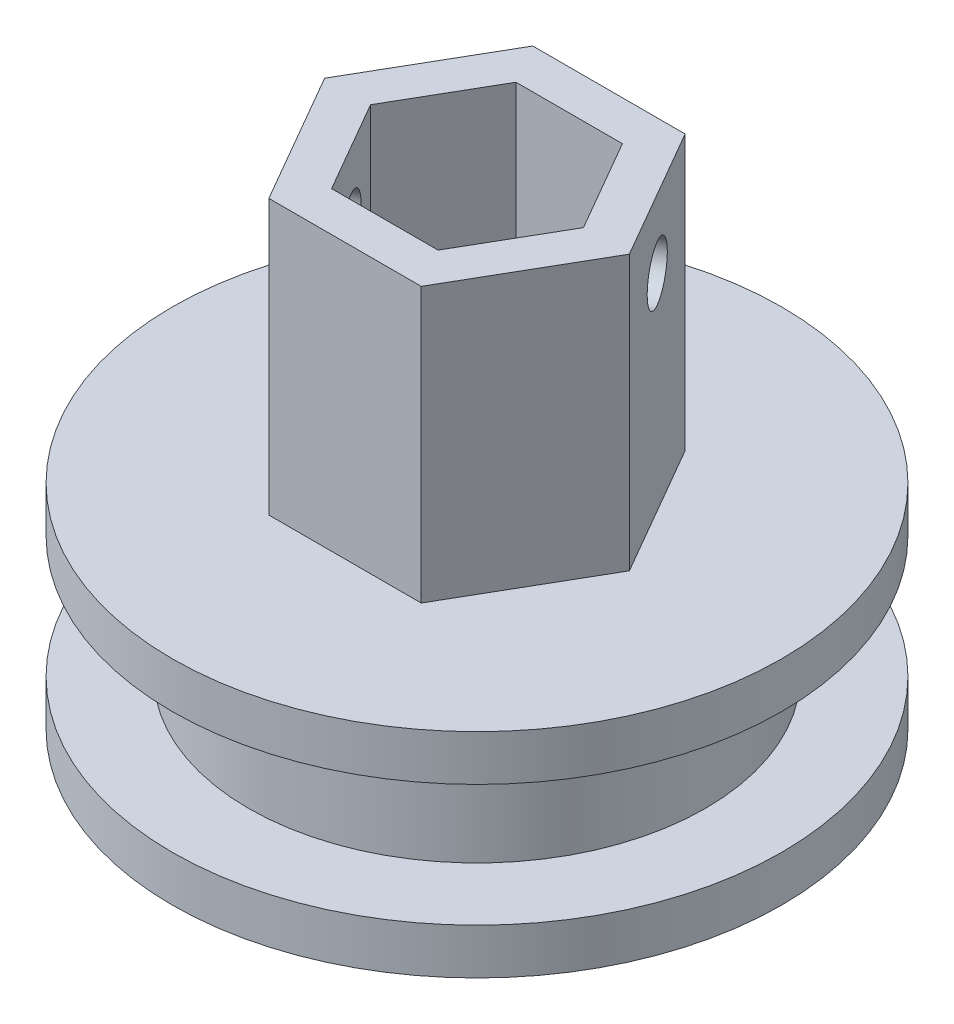
ISO-10303-21;
HEADER;
FILE_DESCRIPTION(('STEP AP214'),'2;1');
FILE_NAME('part.step','',(''),(''),'','','');
FILE_SCHEMA(('AUTOMOTIVE_DESIGN { 1 0 10303 214 1 1 1 1 }'));
ENDSEC;
DATA;
#1=APPLICATION_CONTEXT('core data for automotive mechanical design processes');
#2=APPLICATION_PROTOCOL_DEFINITION('international standard','automotive_design',2000,#1);
#3=PRODUCT_CONTEXT('',#1,'mechanical');
#4=PRODUCT('Part','Part','',(#3));
#5=PRODUCT_RELATED_PRODUCT_CATEGORY('part','',(#4));
#6=PRODUCT_DEFINITION_FORMATION('','',#4);
#7=PRODUCT_DEFINITION_CONTEXT('part definition',#1,'design');
#8=PRODUCT_DEFINITION('design','',#6,#7);
#9=PRODUCT_DEFINITION_SHAPE('','',#8);
#10=(LENGTH_UNIT() NAMED_UNIT(*) SI_UNIT(.MILLI.,.METRE.));
#11=(NAMED_UNIT(*) PLANE_ANGLE_UNIT() SI_UNIT($,.RADIAN.));
#12=(NAMED_UNIT(*) SI_UNIT($,.STERADIAN.) SOLID_ANGLE_UNIT());
#13=UNCERTAINTY_MEASURE_WITH_UNIT(LENGTH_MEASURE(1.E-05),#10,'distance_accuracy_value','');
#14=(GEOMETRIC_REPRESENTATION_CONTEXT(3) GLOBAL_UNCERTAINTY_ASSIGNED_CONTEXT((#13)) GLOBAL_UNIT_ASSIGNED_CONTEXT((#10,
#11,#12)) REPRESENTATION_CONTEXT('',''));
#15=CARTESIAN_POINT('',(0.,0.,0.));
#16=DIRECTION('',(0.,0.,1.));
#17=DIRECTION('',(1.,0.,0.));
#18=AXIS2_PLACEMENT_3D('',#15,#16,#17);
#19=CARTESIAN_POINT('',(5.,-18.,8.66025403784439));
#20=DIRECTION('',(0.866025403784439,0.,0.5));
#21=DIRECTION('',(0.5,0.,-0.866025403784439));
#22=AXIS2_PLACEMENT_3D('',#19,#20,#21);
#23=PLANE('',#22);
#24=DIRECTION('',(0.5,0.,-0.866025403784439));
#25=VECTOR('',#24,1.);
#26=CARTESIAN_POINT('',(5.,0.,8.66025403784439));
#27=LINE('',#26,#25);
#28=CARTESIAN_POINT('',(5.,0.,8.66025403784439));
#29=VERTEX_POINT('',#28);
#30=CARTESIAN_POINT('',(10.,0.,0.));
#31=VERTEX_POINT('',#30);
#32=EDGE_CURVE('E168',#29,#31,#27,.T.);
#33=ORIENTED_EDGE('',*,*,#32,.F.);
#34=DIRECTION('',(0.,1.,0.));
#35=VECTOR('',#34,1.);
#36=CARTESIAN_POINT('',(5.,-18.,8.66025403784439));
#37=LINE('',#36,#35);
#38=CARTESIAN_POINT('',(5.,-18.,8.66025403784439));
#39=VERTEX_POINT('',#38);
#40=EDGE_CURVE('E47',#39,#29,#37,.T.);
#41=ORIENTED_EDGE('',*,*,#40,.F.);
#42=DIRECTION('',(0.5,0.,-0.866025403784439));
#43=VECTOR('',#42,1.);
#44=CARTESIAN_POINT('',(5.,-18.,8.66025403784439));
#45=LINE('',#44,#43);
#46=CARTESIAN_POINT('',(10.,-18.,0.));
#47=VERTEX_POINT('',#46);
#48=EDGE_CURVE('E133',#39,#47,#45,.T.);
#49=ORIENTED_EDGE('',*,*,#48,.T.);
#50=DIRECTION('',(0.,1.,0.));
#51=VECTOR('',#50,1.);
#52=CARTESIAN_POINT('',(10.,-18.,0.));
#53=LINE('',#52,#51);
#54=EDGE_CURVE('E141',#47,#31,#53,.T.);
#55=ORIENTED_EDGE('',*,*,#54,.T.);
#56=EDGE_LOOP('',(#33,#41,#49,#55));
#57=FACE_BOUND('',#56,.T.);
#58=ADVANCED_FACE('F39',(#57),#23,.T.);
#59=CARTESIAN_POINT('',(-5.,-18.,8.66025403784439));
#60=DIRECTION('',(0.,0.,1.));
#61=DIRECTION('',(1.,0.,0.));
#62=AXIS2_PLACEMENT_3D('',#59,#60,#61);
#63=PLANE('',#62);
#64=DIRECTION('',(1.,0.,0.));
#65=VECTOR('',#64,1.);
#66=CARTESIAN_POINT('',(-5.,0.,8.66025403784439));
#67=LINE('',#66,#65);
#68=CARTESIAN_POINT('',(-5.,0.,8.66025403784439));
#69=VERTEX_POINT('',#68);
#70=EDGE_CURVE('E151',#69,#29,#67,.T.);
#71=ORIENTED_EDGE('',*,*,#70,.F.);
#72=DIRECTION('',(0.,1.,0.));
#73=VECTOR('',#72,1.);
#74=CARTESIAN_POINT('',(-5.,-18.,8.66025403784439));
#75=LINE('',#74,#73);
#76=CARTESIAN_POINT('',(-5.,-18.,8.66025403784439));
#77=VERTEX_POINT('',#76);
#78=EDGE_CURVE('E181',#77,#69,#75,.T.);
#79=ORIENTED_EDGE('',*,*,#78,.F.);
#80=DIRECTION('',(1.,0.,0.));
#81=VECTOR('',#80,1.);
#82=CARTESIAN_POINT('',(-5.,-18.,8.66025403784439));
#83=LINE('',#82,#81);
#84=EDGE_CURVE('E149',#77,#39,#83,.T.);
#85=ORIENTED_EDGE('',*,*,#84,.T.);
#86=ORIENTED_EDGE('',*,*,#40,.T.);
#87=EDGE_LOOP('',(#71,#79,#85,#86));
#88=FACE_BOUND('',#87,.T.);
#89=ADVANCED_FACE('F198',(#88),#63,.T.);
#90=CARTESIAN_POINT('',(-10.,-18.,0.));
#91=DIRECTION('',(-0.866025403784439,0.,0.5));
#92=DIRECTION('',(0.5,0.,0.866025403784439));
#93=AXIS2_PLACEMENT_3D('',#90,#91,#92);
#94=PLANE('',#93);
#95=CARTESIAN_POINT('',(-7.5,-4.5,4.3301270189222));
#96=DIRECTION('',(-0.866025403784439,0.,0.5));
#97=DIRECTION('',(0.5,0.,0.866025403784439));
#98=AXIS2_PLACEMENT_3D('',#95,#96,#97);
#99=CIRCLE('',#98,1.8);
#100=CARTESIAN_POINT('',(-6.6,-4.5,5.88897274573419));
#101=VERTEX_POINT('',#100);
#102=EDGE_CURVE('E315',#101,#101,#99,.T.);
#103=ORIENTED_EDGE('',*,*,#102,.F.);
#104=EDGE_LOOP('',(#103));
#105=FACE_BOUND('',#104,.T.);
#106=DIRECTION('',(0.5,0.,0.866025403784439));
#107=VECTOR('',#106,1.);
#108=CARTESIAN_POINT('',(-10.,0.,0.));
#109=LINE('',#108,#107);
#110=CARTESIAN_POINT('',(-10.,0.,0.));
#111=VERTEX_POINT('',#110);
#112=EDGE_CURVE('E154',#111,#69,#109,.T.);
#113=ORIENTED_EDGE('',*,*,#112,.F.);
#114=DIRECTION('',(0.,1.,0.));
#115=VECTOR('',#114,1.);
#116=CARTESIAN_POINT('',(-10.,-18.,0.));
#117=LINE('',#116,#115);
#118=CARTESIAN_POINT('',(-10.,-18.,0.));
#119=VERTEX_POINT('',#118);
#120=EDGE_CURVE('E183',#119,#111,#117,.T.);
#121=ORIENTED_EDGE('',*,*,#120,.F.);
#122=DIRECTION('',(0.5,0.,0.866025403784439));
#123=VECTOR('',#122,1.);
#124=CARTESIAN_POINT('',(-10.,-18.,0.));
#125=LINE('',#124,#123);
#126=EDGE_CURVE('E164',#119,#77,#125,.T.);
#127=ORIENTED_EDGE('',*,*,#126,.T.);
#128=ORIENTED_EDGE('',*,*,#78,.T.);
#129=EDGE_LOOP('',(#113,#121,#127,#128));
#130=FACE_BOUND('',#129,.T.);
#131=ADVANCED_FACE('F201',(#105,#130),#94,.T.);
#132=CARTESIAN_POINT('',(-5.,-18.,-8.66025403784439));
#133=DIRECTION('',(-0.866025403784439,0.,-0.5));
#134=DIRECTION('',(-0.5,0.,0.866025403784439));
#135=AXIS2_PLACEMENT_3D('',#132,#133,#134);
#136=PLANE('',#135);
#137=DIRECTION('',(-0.5,0.,0.866025403784439));
#138=VECTOR('',#137,1.);
#139=CARTESIAN_POINT('',(-5.,0.,-8.66025403784439));
#140=LINE('',#139,#138);
#141=CARTESIAN_POINT('',(-5.,0.,-8.66025403784439));
#142=VERTEX_POINT('',#141);
#143=EDGE_CURVE('E175',#142,#111,#140,.T.);
#144=ORIENTED_EDGE('',*,*,#143,.F.);
#145=DIRECTION('',(0.,1.,0.));
#146=VECTOR('',#145,1.);
#147=CARTESIAN_POINT('',(-5.,-18.,-8.66025403784439));
#148=LINE('',#147,#146);
#149=CARTESIAN_POINT('',(-5.,-18.,-8.66025403784439));
#150=VERTEX_POINT('',#149);
#151=EDGE_CURVE('E185',#150,#142,#148,.T.);
#152=ORIENTED_EDGE('',*,*,#151,.F.);
#153=DIRECTION('',(-0.5,0.,0.866025403784439));
#154=VECTOR('',#153,1.);
#155=CARTESIAN_POINT('',(-5.,-18.,-8.66025403784439));
#156=LINE('',#155,#154);
#157=EDGE_CURVE('E161',#150,#119,#156,.T.);
#158=ORIENTED_EDGE('',*,*,#157,.T.);
#159=ORIENTED_EDGE('',*,*,#120,.T.);
#160=EDGE_LOOP('',(#144,#152,#158,#159));
#161=FACE_BOUND('',#160,.T.);
#162=ADVANCED_FACE('F203',(#161),#136,.T.);
#163=CARTESIAN_POINT('',(5.,-18.,-8.66025403784439));
#164=DIRECTION('',(0.,0.,-1.));
#165=DIRECTION('',(-1.,0.,0.));
#166=AXIS2_PLACEMENT_3D('',#163,#164,#165);
#167=PLANE('',#166);
#168=DIRECTION('',(-1.,0.,0.));
#169=VECTOR('',#168,1.);
#170=CARTESIAN_POINT('',(5.,0.,-8.66025403784439));
#171=LINE('',#170,#169);
#172=CARTESIAN_POINT('',(5.,0.,-8.66025403784439));
#173=VERTEX_POINT('',#172);
#174=EDGE_CURVE('E172',#173,#142,#171,.T.);
#175=ORIENTED_EDGE('',*,*,#174,.F.);
#176=DIRECTION('',(0.,1.,0.));
#177=VECTOR('',#176,1.);
#178=CARTESIAN_POINT('',(5.,-18.,-8.66025403784439));
#179=LINE('',#178,#177);
#180=CARTESIAN_POINT('',(5.,-18.,-8.66025403784439));
#181=VERTEX_POINT('',#180);
#182=EDGE_CURVE('E148',#181,#173,#179,.T.);
#183=ORIENTED_EDGE('',*,*,#182,.F.);
#184=DIRECTION('',(-1.,0.,0.));
#185=VECTOR('',#184,1.);
#186=CARTESIAN_POINT('',(5.,-18.,-8.66025403784439));
#187=LINE('',#186,#185);
#188=EDGE_CURVE('E136',#181,#150,#187,.T.);
#189=ORIENTED_EDGE('',*,*,#188,.T.);
#190=ORIENTED_EDGE('',*,*,#151,.T.);
#191=EDGE_LOOP('',(#175,#183,#189,#190));
#192=FACE_BOUND('',#191,.T.);
#193=ADVANCED_FACE('F189',(#192),#167,.T.);
#194=CARTESIAN_POINT('',(10.,-18.,0.));
#195=DIRECTION('',(0.866025403784439,0.,-0.5));
#196=DIRECTION('',(-0.5,0.,-0.866025403784439));
#197=AXIS2_PLACEMENT_3D('',#194,#195,#196);
#198=PLANE('',#197);
#199=CARTESIAN_POINT('',(7.50000000000001,-4.5,-4.3301270189222));
#200=DIRECTION('',(0.866025403784439,0.,-0.5));
#201=DIRECTION('',(-0.5,0.,-0.866025403784439));
#202=AXIS2_PLACEMENT_3D('',#199,#200,#201);
#203=CIRCLE('',#202,1.8);
#204=CARTESIAN_POINT('',(6.6,-4.5,-5.88897274573419));
#205=VERTEX_POINT('',#204);
#206=EDGE_CURVE('E307',#205,#205,#203,.T.);
#207=ORIENTED_EDGE('',*,*,#206,.F.);
#208=EDGE_LOOP('',(#207));
#209=FACE_BOUND('',#208,.T.);
#210=DIRECTION('',(-0.5,0.,-0.866025403784439));
#211=VECTOR('',#210,1.);
#212=CARTESIAN_POINT('',(10.,0.,0.));
#213=LINE('',#212,#211);
#214=EDGE_CURVE('E144',#31,#173,#213,.T.);
#215=ORIENTED_EDGE('',*,*,#214,.F.);
#216=ORIENTED_EDGE('',*,*,#54,.F.);
#217=DIRECTION('',(-0.5,0.,-0.866025403784439));
#218=VECTOR('',#217,1.);
#219=CARTESIAN_POINT('',(10.,-18.,0.));
#220=LINE('',#219,#218);
#221=EDGE_CURVE('E128',#47,#181,#220,.T.);
#222=ORIENTED_EDGE('',*,*,#221,.T.);
#223=ORIENTED_EDGE('',*,*,#182,.T.);
#224=EDGE_LOOP('',(#215,#216,#222,#223));
#225=FACE_BOUND('',#224,.T.);
#226=ADVANCED_FACE('F142',(#209,#225),#198,.T.);
#227=CARTESIAN_POINT('',(0.,0.,0.));
#228=DIRECTION('',(0.,1.,0.));
#229=DIRECTION('',(0.,0.,1.));
#230=AXIS2_PLACEMENT_3D('',#227,#228,#229);
#231=PLANE('',#230);
#232=DIRECTION('',(0.5,0.,-0.866025403784439));
#233=VECTOR('',#232,1.);
#234=CARTESIAN_POINT('',(3.49296912859724,0.,6.05000000000001));
#235=LINE('',#234,#233);
#236=CARTESIAN_POINT('',(3.49296912859724,0.,6.05000000000001));
#237=VERTEX_POINT('',#236);
#238=CARTESIAN_POINT('',(6.98593825719448,0.,0.));
#239=VERTEX_POINT('',#238);
#240=EDGE_CURVE('E63',#237,#239,#235,.T.);
#241=ORIENTED_EDGE('',*,*,#240,.F.);
#242=DIRECTION('',(1.,0.,0.));
#243=VECTOR('',#242,1.);
#244=CARTESIAN_POINT('',(-3.49296912859724,0.,6.05000000000001));
#245=LINE('',#244,#243);
#246=CARTESIAN_POINT('',(-3.49296912859724,0.,6.05000000000001));
#247=VERTEX_POINT('',#246);
#248=EDGE_CURVE('E322',#247,#237,#245,.T.);
#249=ORIENTED_EDGE('',*,*,#248,.F.);
#250=DIRECTION('',(0.5,0.,0.866025403784438));
#251=VECTOR('',#250,1.);
#252=CARTESIAN_POINT('',(-6.98593825719448,0.,0.));
#253=LINE('',#252,#251);
#254=CARTESIAN_POINT('',(-6.98593825719448,0.,0.));
#255=VERTEX_POINT('',#254);
#256=EDGE_CURVE('E345',#255,#247,#253,.T.);
#257=ORIENTED_EDGE('',*,*,#256,.F.);
#258=DIRECTION('',(-0.5,0.,0.866025403784439));
#259=VECTOR('',#258,1.);
#260=CARTESIAN_POINT('',(-3.49296912859724,0.,-6.05000000000001));
#261=LINE('',#260,#259);
#262=CARTESIAN_POINT('',(-3.49296912859724,0.,-6.05000000000001));
#263=VERTEX_POINT('',#262);
#264=EDGE_CURVE('E342',#263,#255,#261,.T.);
#265=ORIENTED_EDGE('',*,*,#264,.F.);
#266=DIRECTION('',(-1.,0.,0.));
#267=VECTOR('',#266,1.);
#268=CARTESIAN_POINT('',(3.49296912859724,0.,-6.05000000000001));
#269=LINE('',#268,#267);
#270=CARTESIAN_POINT('',(3.49296912859724,0.,-6.05000000000001));
#271=VERTEX_POINT('',#270);
#272=EDGE_CURVE('E339',#271,#263,#269,.T.);
#273=ORIENTED_EDGE('',*,*,#272,.F.);
#274=DIRECTION('',(-0.5,0.,-0.866025403784439));
#275=VECTOR('',#274,1.);
#276=CARTESIAN_POINT('',(6.98593825719448,0.,0.));
#277=LINE('',#276,#275);
#278=EDGE_CURVE('E336',#239,#271,#277,.T.);
#279=ORIENTED_EDGE('',*,*,#278,.F.);
#280=EDGE_LOOP('',(#241,#249,#257,#265,#273,#279));
#281=FACE_BOUND('',#280,.T.);
#282=ORIENTED_EDGE('',*,*,#32,.T.);
#283=ORIENTED_EDGE('',*,*,#214,.T.);
#284=ORIENTED_EDGE('',*,*,#174,.T.);
#285=ORIENTED_EDGE('',*,*,#143,.T.);
#286=ORIENTED_EDGE('',*,*,#112,.T.);
#287=ORIENTED_EDGE('',*,*,#70,.T.);
#288=EDGE_LOOP('',(#282,#283,#284,#285,#286,#287));
#289=FACE_BOUND('',#288,.T.);
#290=ADVANCED_FACE('F193',(#281,#289),#231,.T.);
#291=CARTESIAN_POINT('',(3.49296912859724,-18.,6.05000000000001));
#292=DIRECTION('',(0.866025403784439,0.,0.5));
#293=DIRECTION('',(0.5,0.,-0.866025403784439));
#294=AXIS2_PLACEMENT_3D('',#291,#292,#293);
#295=PLANE('',#294);
#296=ORIENTED_EDGE('',*,*,#240,.T.);
#297=DIRECTION('',(0.,1.,0.));
#298=VECTOR('',#297,1.);
#299=CARTESIAN_POINT('',(6.98593825719448,-18.,0.));
#300=LINE('',#299,#298);
#301=CARTESIAN_POINT('',(6.98593825719448,-18.,0.));
#302=VERTEX_POINT('',#301);
#303=EDGE_CURVE('E157',#302,#239,#300,.T.);
#304=ORIENTED_EDGE('',*,*,#303,.F.);
#305=DIRECTION('',(0.5,0.,-0.866025403784439));
#306=VECTOR('',#305,1.);
#307=CARTESIAN_POINT('',(3.49296912859724,-18.,6.05000000000001));
#308=LINE('',#307,#306);
#309=CARTESIAN_POINT('',(3.49296912859724,-18.,6.05000000000001));
#310=VERTEX_POINT('',#309);
#311=EDGE_CURVE('E318',#310,#302,#308,.T.);
#312=ORIENTED_EDGE('',*,*,#311,.F.);
#313=DIRECTION('',(0.,1.,0.));
#314=VECTOR('',#313,1.);
#315=CARTESIAN_POINT('',(3.49296912859724,-18.,6.05000000000001));
#316=LINE('',#315,#314);
#317=EDGE_CURVE('E170',#310,#237,#316,.T.);
#318=ORIENTED_EDGE('',*,*,#317,.T.);
#319=EDGE_LOOP('',(#296,#304,#312,#318));
#320=FACE_BOUND('',#319,.T.);
#321=ADVANCED_FACE('F223',(#320),#295,.F.);
#322=CARTESIAN_POINT('',(-3.49296912859724,-18.,6.05000000000001));
#323=DIRECTION('',(0.,0.,1.));
#324=DIRECTION('',(1.,0.,0.));
#325=AXIS2_PLACEMENT_3D('',#322,#323,#324);
#326=PLANE('',#325);
#327=ORIENTED_EDGE('',*,*,#248,.T.);
#328=ORIENTED_EDGE('',*,*,#317,.F.);
#329=DIRECTION('',(1.,0.,0.));
#330=VECTOR('',#329,1.);
#331=CARTESIAN_POINT('',(-3.49296912859724,-18.,6.05000000000001));
#332=LINE('',#331,#330);
#333=CARTESIAN_POINT('',(-3.49296912859724,-18.,6.05000000000001));
#334=VERTEX_POINT('',#333);
#335=EDGE_CURVE('E332',#334,#310,#332,.T.);
#336=ORIENTED_EDGE('',*,*,#335,.F.);
#337=DIRECTION('',(0.,1.,0.));
#338=VECTOR('',#337,1.);
#339=CARTESIAN_POINT('',(-3.49296912859724,-18.,6.05000000000001));
#340=LINE('',#339,#338);
#341=EDGE_CURVE('E351',#334,#247,#340,.T.);
#342=ORIENTED_EDGE('',*,*,#341,.T.);
#343=EDGE_LOOP('',(#327,#328,#336,#342));
#344=FACE_BOUND('',#343,.T.);
#345=ADVANCED_FACE('F227',(#344),#326,.F.);
#346=CARTESIAN_POINT('',(-6.98593825719448,-18.,0.));
#347=DIRECTION('',(-0.866025403784439,0.,0.5));
#348=DIRECTION('',(0.5,0.,0.866025403784439));
#349=AXIS2_PLACEMENT_3D('',#346,#347,#348);
#350=PLANE('',#349);
#351=CARTESIAN_POINT('',(-5.23945369289586,-4.5,3.02500000000001));
#352=DIRECTION('',(-0.866025403784439,0.,0.5));
#353=DIRECTION('',(0.5,0.,0.866025403784439));
#354=AXIS2_PLACEMENT_3D('',#351,#352,#353);
#355=CIRCLE('',#354,1.8);
#356=CARTESIAN_POINT('',(-4.33945369289586,-4.5,4.583845726812));
#357=VERTEX_POINT('',#356);
#358=EDGE_CURVE('E312',#357,#357,#355,.T.);
#359=ORIENTED_EDGE('',*,*,#358,.T.);
#360=EDGE_LOOP('',(#359));
#361=FACE_BOUND('',#360,.T.);
#362=ORIENTED_EDGE('',*,*,#256,.T.);
#363=ORIENTED_EDGE('',*,*,#341,.F.);
#364=DIRECTION('',(0.5,0.,0.866025403784438));
#365=VECTOR('',#364,1.);
#366=CARTESIAN_POINT('',(-6.98593825719448,-18.,0.));
#367=LINE('',#366,#365);
#368=CARTESIAN_POINT('',(-6.98593825719448,-18.,0.));
#369=VERTEX_POINT('',#368);
#370=EDGE_CURVE('E329',#369,#334,#367,.T.);
#371=ORIENTED_EDGE('',*,*,#370,.F.);
#372=DIRECTION('',(0.,1.,0.));
#373=VECTOR('',#372,1.);
#374=CARTESIAN_POINT('',(-6.98593825719448,-18.,0.));
#375=LINE('',#374,#373);
#376=EDGE_CURVE('E353',#369,#255,#375,.T.);
#377=ORIENTED_EDGE('',*,*,#376,.T.);
#378=EDGE_LOOP('',(#362,#363,#371,#377));
#379=FACE_BOUND('',#378,.T.);
#380=ADVANCED_FACE('F239',(#361,#379),#350,.F.);
#381=CARTESIAN_POINT('',(-3.49296912859724,-18.,-6.05000000000001));
#382=DIRECTION('',(-0.866025403784439,0.,-0.5));
#383=DIRECTION('',(-0.5,0.,0.866025403784439));
#384=AXIS2_PLACEMENT_3D('',#381,#382,#383);
#385=PLANE('',#384);
#386=ORIENTED_EDGE('',*,*,#264,.T.);
#387=ORIENTED_EDGE('',*,*,#376,.F.);
#388=DIRECTION('',(-0.5,0.,0.866025403784439));
#389=VECTOR('',#388,1.);
#390=CARTESIAN_POINT('',(-3.49296912859724,-18.,-6.05000000000001));
#391=LINE('',#390,#389);
#392=CARTESIAN_POINT('',(-3.49296912859724,-18.,-6.05000000000001));
#393=VERTEX_POINT('',#392);
#394=EDGE_CURVE('E326',#393,#369,#391,.T.);
#395=ORIENTED_EDGE('',*,*,#394,.F.);
#396=DIRECTION('',(0.,1.,0.));
#397=VECTOR('',#396,1.);
#398=CARTESIAN_POINT('',(-3.49296912859724,-18.,-6.05000000000001));
#399=LINE('',#398,#397);
#400=EDGE_CURVE('E355',#393,#263,#399,.T.);
#401=ORIENTED_EDGE('',*,*,#400,.T.);
#402=EDGE_LOOP('',(#386,#387,#395,#401));
#403=FACE_BOUND('',#402,.T.);
#404=ADVANCED_FACE('F236',(#403),#385,.F.);
#405=CARTESIAN_POINT('',(3.49296912859724,-18.,-6.05000000000001));
#406=DIRECTION('',(0.,0.,-1.));
#407=DIRECTION('',(-1.,0.,0.));
#408=AXIS2_PLACEMENT_3D('',#405,#406,#407);
#409=PLANE('',#408);
#410=ORIENTED_EDGE('',*,*,#272,.T.);
#411=ORIENTED_EDGE('',*,*,#400,.F.);
#412=DIRECTION('',(-1.,0.,0.));
#413=VECTOR('',#412,1.);
#414=CARTESIAN_POINT('',(3.49296912859724,-18.,-6.05000000000001));
#415=LINE('',#414,#413);
#416=CARTESIAN_POINT('',(3.49296912859724,-18.,-6.05000000000001));
#417=VERTEX_POINT('',#416);
#418=EDGE_CURVE('E55',#417,#393,#415,.T.);
#419=ORIENTED_EDGE('',*,*,#418,.F.);
#420=DIRECTION('',(0.,1.,0.));
#421=VECTOR('',#420,1.);
#422=CARTESIAN_POINT('',(3.49296912859724,-18.,-6.05000000000001));
#423=LINE('',#422,#421);
#424=EDGE_CURVE('E356',#417,#271,#423,.T.);
#425=ORIENTED_EDGE('',*,*,#424,.T.);
#426=EDGE_LOOP('',(#410,#411,#419,#425));
#427=FACE_BOUND('',#426,.T.);
#428=ADVANCED_FACE('F232',(#427),#409,.F.);
#429=CARTESIAN_POINT('',(6.98593825719448,-18.,0.));
#430=DIRECTION('',(0.866025403784439,0.,-0.5));
#431=DIRECTION('',(-0.5,0.,-0.866025403784439));
#432=AXIS2_PLACEMENT_3D('',#429,#430,#431);
#433=PLANE('',#432);
#434=CARTESIAN_POINT('',(5.23945369289586,-4.5,-3.025));
#435=DIRECTION('',(0.866025403784439,0.,-0.5));
#436=DIRECTION('',(-0.5,0.,-0.866025403784439));
#437=AXIS2_PLACEMENT_3D('',#434,#435,#436);
#438=CIRCLE('',#437,1.8);
#439=CARTESIAN_POINT('',(4.33945369289586,-4.5,-4.58384572681199));
#440=VERTEX_POINT('',#439);
#441=EDGE_CURVE('E42',#440,#440,#438,.T.);
#442=ORIENTED_EDGE('',*,*,#441,.T.);
#443=EDGE_LOOP('',(#442));
#444=FACE_BOUND('',#443,.T.);
#445=ORIENTED_EDGE('',*,*,#278,.T.);
#446=ORIENTED_EDGE('',*,*,#424,.F.);
#447=DIRECTION('',(-0.5,0.,-0.866025403784439));
#448=VECTOR('',#447,1.);
#449=CARTESIAN_POINT('',(6.98593825719448,-18.,0.));
#450=LINE('',#449,#448);
#451=EDGE_CURVE('E321',#302,#417,#450,.T.);
#452=ORIENTED_EDGE('',*,*,#451,.F.);
#453=ORIENTED_EDGE('',*,*,#303,.T.);
#454=EDGE_LOOP('',(#445,#446,#452,#453));
#455=FACE_BOUND('',#454,.T.);
#456=ADVANCED_FACE('F228',(#444,#455),#433,.F.);
#457=CARTESIAN_POINT('',(-7.50389012056539,-4.5,4.33237298107781));
#458=DIRECTION('',(0.866025403784438,0.,-0.5));
#459=DIRECTION('',(-0.5,0.,-0.866025403784439));
#460=AXIS2_PLACEMENT_3D('',#457,#458,#459);
#461=CYLINDRICAL_SURFACE('',#460,1.8);
#462=ORIENTED_EDGE('',*,*,#206,.T.);
#463=EDGE_LOOP('',(#462));
#464=FACE_BOUND('',#463,.T.);
#465=ORIENTED_EDGE('',*,*,#441,.F.);
#466=EDGE_LOOP('',(#465));
#467=FACE_BOUND('',#466,.T.);
#468=ADVANCED_FACE('F231',(#464,#467),#461,.F.);
#469=ORIENTED_EDGE('',*,*,#102,.T.);
#470=EDGE_LOOP('',(#469));
#471=FACE_BOUND('',#470,.T.);
#472=ORIENTED_EDGE('',*,*,#358,.F.);
#473=EDGE_LOOP('',(#472));
#474=FACE_BOUND('',#473,.T.);
#475=ADVANCED_FACE('F247',(#471,#474),#461,.F.);
#476=CARTESIAN_POINT('',(0.,-18.,0.));
#477=DIRECTION('',(0.,-1.,0.));
#478=DIRECTION('',(0.,0.,-1.));
#479=AXIS2_PLACEMENT_3D('',#476,#477,#478);
#480=PLANE('',#479);
#481=CARTESIAN_POINT('',(0.,-18.,0.));
#482=DIRECTION('',(0.,-1.,0.));
#483=DIRECTION('',(0.,0.,-1.));
#484=AXIS2_PLACEMENT_3D('',#481,#482,#483);
#485=CIRCLE('',#484,1.75);
#486=CARTESIAN_POINT('',(0.,-18.,-1.75));
#487=VERTEX_POINT('',#486);
#488=EDGE_CURVE('E299',#487,#487,#485,.T.);
#489=ORIENTED_EDGE('',*,*,#488,.T.);
#490=EDGE_LOOP('',(#489));
#491=FACE_BOUND('',#490,.T.);
#492=ORIENTED_EDGE('',*,*,#370,.T.);
#493=ORIENTED_EDGE('',*,*,#335,.T.);
#494=ORIENTED_EDGE('',*,*,#311,.T.);
#495=ORIENTED_EDGE('',*,*,#451,.T.);
#496=ORIENTED_EDGE('',*,*,#418,.T.);
#497=ORIENTED_EDGE('',*,*,#394,.T.);
#498=EDGE_LOOP('',(#492,#493,#494,#495,#496,#497));
#499=FACE_BOUND('',#498,.T.);
#500=ADVANCED_FACE('F250',(#491,#499),#480,.F.);
#501=CARTESIAN_POINT('',(0.,-21.,0.));
#502=DIRECTION('',(0.,-1.,0.));
#503=DIRECTION('',(0.,0.,-1.));
#504=AXIS2_PLACEMENT_3D('',#501,#502,#503);
#505=PLANE('',#504);
#506=CARTESIAN_POINT('',(0.,-21.,0.));
#507=DIRECTION('',(0.,-1.,0.));
#508=DIRECTION('',(0.,0.,-1.));
#509=AXIS2_PLACEMENT_3D('',#506,#507,#508);
#510=CIRCLE('',#509,15.);
#511=CARTESIAN_POINT('',(0.,-21.,-15.));
#512=VERTEX_POINT('',#511);
#513=EDGE_CURVE('E11',#512,#512,#510,.T.);
#514=ORIENTED_EDGE('',*,*,#513,.F.);
#515=EDGE_LOOP('',(#514));
#516=FACE_BOUND('',#515,.T.);
#517=CARTESIAN_POINT('',(0.,-21.,0.));
#518=DIRECTION('',(0.,-1.,0.));
#519=DIRECTION('',(0.,0.,-1.));
#520=AXIS2_PLACEMENT_3D('',#517,#518,#519);
#521=CIRCLE('',#520,20.);
#522=CARTESIAN_POINT('',(0.,-21.,-20.));
#523=VERTEX_POINT('',#522);
#524=EDGE_CURVE('E304',#523,#523,#521,.T.);
#525=ORIENTED_EDGE('',*,*,#524,.T.);
#526=EDGE_LOOP('',(#525));
#527=FACE_BOUND('',#526,.T.);
#528=ADVANCED_FACE('F259',(#516,#527),#505,.T.);
#529=ORIENTED_EDGE('',*,*,#48,.F.);
#530=ORIENTED_EDGE('',*,*,#84,.F.);
#531=ORIENTED_EDGE('',*,*,#126,.F.);
#532=ORIENTED_EDGE('',*,*,#157,.F.);
#533=ORIENTED_EDGE('',*,*,#188,.F.);
#534=ORIENTED_EDGE('',*,*,#221,.F.);
#535=EDGE_LOOP('',(#529,#530,#531,#532,#533,#534));
#536=FACE_BOUND('',#535,.T.);
#537=CARTESIAN_POINT('',(0.,-18.,0.));
#538=DIRECTION('',(0.,-1.,0.));
#539=DIRECTION('',(0.,0.,-1.));
#540=AXIS2_PLACEMENT_3D('',#537,#538,#539);
#541=CIRCLE('',#540,20.);
#542=CARTESIAN_POINT('',(0.,-18.,-20.));
#543=VERTEX_POINT('',#542);
#544=EDGE_CURVE('E303',#543,#543,#541,.T.);
#545=ORIENTED_EDGE('',*,*,#544,.F.);
#546=EDGE_LOOP('',(#545));
#547=FACE_BOUND('',#546,.T.);
#548=ADVANCED_FACE('F130',(#536,#547),#480,.F.);
#549=CARTESIAN_POINT('',(0.,-21.,0.));
#550=DIRECTION('',(0.,1.,0.));
#551=DIRECTION('',(0.,0.,1.));
#552=AXIS2_PLACEMENT_3D('',#549,#550,#551);
#553=CYLINDRICAL_SURFACE('',#552,20.);
#554=ORIENTED_EDGE('',*,*,#524,.F.);
#555=EDGE_LOOP('',(#554));
#556=FACE_BOUND('',#555,.T.);
#557=ORIENTED_EDGE('',*,*,#544,.T.);
#558=EDGE_LOOP('',(#557));
#559=FACE_BOUND('',#558,.T.);
#560=ADVANCED_FACE('F252',(#556,#559),#553,.T.);
#561=CARTESIAN_POINT('',(0.,-21.,0.));
#562=DIRECTION('',(0.,1.,0.));
#563=DIRECTION('',(0.,0.,1.));
#564=AXIS2_PLACEMENT_3D('',#561,#562,#563);
#565=CYLINDRICAL_SURFACE('',#564,1.75);
#566=ORIENTED_EDGE('',*,*,#488,.F.);
#567=EDGE_LOOP('',(#566));
#568=FACE_BOUND('',#567,.T.);
#569=CARTESIAN_POINT('',(0.,-32.,0.));
#570=DIRECTION('',(0.,-1.,0.));
#571=DIRECTION('',(0.,0.,-1.));
#572=AXIS2_PLACEMENT_3D('',#569,#570,#571);
#573=CIRCLE('',#572,1.75);
#574=CARTESIAN_POINT('',(0.,-32.,-1.75));
#575=VERTEX_POINT('',#574);
#576=EDGE_CURVE('E289',#575,#575,#573,.T.);
#577=ORIENTED_EDGE('',*,*,#576,.T.);
#578=EDGE_LOOP('',(#577));
#579=FACE_BOUND('',#578,.T.);
#580=ADVANCED_FACE('F255',(#568,#579),#565,.F.);
#581=CARTESIAN_POINT('',(0.,-29.,0.));
#582=DIRECTION('',(0.,1.,0.));
#583=DIRECTION('',(0.,0.,1.));
#584=AXIS2_PLACEMENT_3D('',#581,#582,#583);
#585=CYLINDRICAL_SURFACE('',#584,15.);
#586=CARTESIAN_POINT('',(0.,-29.,0.));
#587=DIRECTION('',(0.,-1.,0.));
#588=DIRECTION('',(0.,0.,-1.));
#589=AXIS2_PLACEMENT_3D('',#586,#587,#588);
#590=CIRCLE('',#589,15.);
#591=CARTESIAN_POINT('',(0.,-29.,-15.));
#592=VERTEX_POINT('',#591);
#593=EDGE_CURVE('E296',#592,#592,#590,.T.);
#594=ORIENTED_EDGE('',*,*,#593,.F.);
#595=EDGE_LOOP('',(#594));
#596=FACE_BOUND('',#595,.T.);
#597=ORIENTED_EDGE('',*,*,#513,.T.);
#598=EDGE_LOOP('',(#597));
#599=FACE_BOUND('',#598,.T.);
#600=ADVANCED_FACE('F265',(#596,#599),#585,.T.);
#601=CARTESIAN_POINT('',(0.,-32.,0.));
#602=DIRECTION('',(0.,-1.,0.));
#603=DIRECTION('',(0.,0.,-1.));
#604=AXIS2_PLACEMENT_3D('',#601,#602,#603);
#605=PLANE('',#604);
#606=CARTESIAN_POINT('',(0.,-32.,0.));
#607=DIRECTION('',(0.,-1.,0.));
#608=DIRECTION('',(0.,0.,-1.));
#609=AXIS2_PLACEMENT_3D('',#606,#607,#608);
#610=CIRCLE('',#609,20.);
#611=CARTESIAN_POINT('',(0.,-32.,-20.));
#612=VERTEX_POINT('',#611);
#613=EDGE_CURVE('E286',#612,#612,#610,.T.);
#614=ORIENTED_EDGE('',*,*,#613,.T.);
#615=EDGE_LOOP('',(#614));
#616=FACE_BOUND('',#615,.T.);
#617=ORIENTED_EDGE('',*,*,#576,.F.);
#618=EDGE_LOOP('',(#617));
#619=FACE_BOUND('',#618,.T.);
#620=ADVANCED_FACE('F269',(#616,#619),#605,.T.);
#621=CARTESIAN_POINT('',(0.,-29.,0.));
#622=DIRECTION('',(0.,-1.,0.));
#623=DIRECTION('',(0.,0.,-1.));
#624=AXIS2_PLACEMENT_3D('',#621,#622,#623);
#625=PLANE('',#624);
#626=ORIENTED_EDGE('',*,*,#593,.T.);
#627=EDGE_LOOP('',(#626));
#628=FACE_BOUND('',#627,.T.);
#629=CARTESIAN_POINT('',(0.,-29.,0.));
#630=DIRECTION('',(0.,-1.,0.));
#631=DIRECTION('',(0.,0.,-1.));
#632=AXIS2_PLACEMENT_3D('',#629,#630,#631);
#633=CIRCLE('',#632,20.);
#634=CARTESIAN_POINT('',(0.,-29.,-20.));
#635=VERTEX_POINT('',#634);
#636=EDGE_CURVE('E291',#635,#635,#633,.T.);
#637=ORIENTED_EDGE('',*,*,#636,.F.);
#638=EDGE_LOOP('',(#637));
#639=FACE_BOUND('',#638,.T.);
#640=ADVANCED_FACE('F274',(#628,#639),#625,.F.);
#641=CARTESIAN_POINT('',(0.,-32.,0.));
#642=DIRECTION('',(0.,1.,0.));
#643=DIRECTION('',(0.,0.,1.));
#644=AXIS2_PLACEMENT_3D('',#641,#642,#643);
#645=CYLINDRICAL_SURFACE('',#644,20.);
#646=ORIENTED_EDGE('',*,*,#613,.F.);
#647=EDGE_LOOP('',(#646));
#648=FACE_BOUND('',#647,.T.);
#649=ORIENTED_EDGE('',*,*,#636,.T.);
#650=EDGE_LOOP('',(#649));
#651=FACE_BOUND('',#650,.T.);
#652=ADVANCED_FACE('F271',(#648,#651),#645,.T.);
#653=CLOSED_SHELL('',(#58,#89,#131,#162,#193,#226,#290,#321,#345,#380,#404,#428,#456,#468,#475,
#500,#528,#548,#560,#580,#600,#620,#640,#652));
#654=MANIFOLD_SOLID_BREP('B2',#653);
#655=ADVANCED_BREP_SHAPE_REPRESENTATION('',(#18,#654),#14);
#656=SHAPE_DEFINITION_REPRESENTATION(#9,#655);
ENDSEC;
END-ISO-10303-21;
